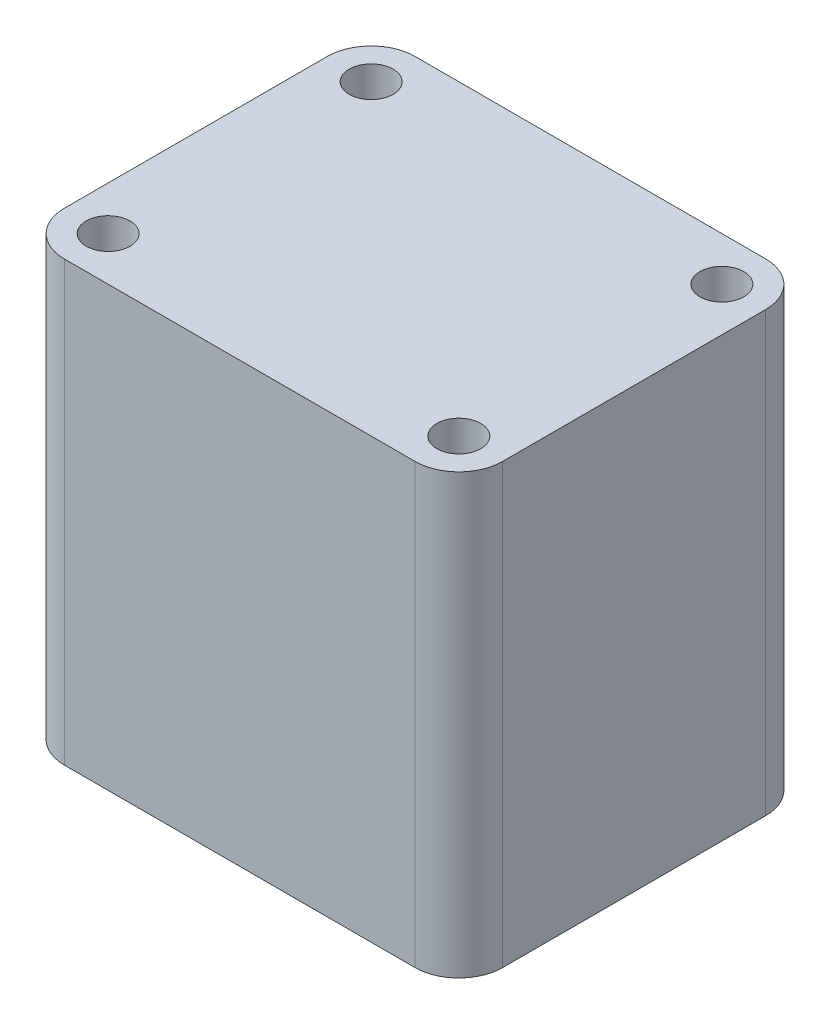
ISO-10303-21;
HEADER;
FILE_DESCRIPTION(('STEP AP214'),'2;1');
FILE_NAME('part.step','',(''),(''),'','','');
FILE_SCHEMA(('AUTOMOTIVE_DESIGN { 1 0 10303 214 1 1 1 1 }'));
ENDSEC;
DATA;
#1=APPLICATION_CONTEXT('core data for automotive mechanical design processes');
#2=APPLICATION_PROTOCOL_DEFINITION('international standard','automotive_design',2000,#1);
#3=PRODUCT_CONTEXT('',#1,'mechanical');
#4=PRODUCT('Part','Part','',(#3));
#5=PRODUCT_RELATED_PRODUCT_CATEGORY('part','',(#4));
#6=PRODUCT_DEFINITION_FORMATION('','',#4);
#7=PRODUCT_DEFINITION_CONTEXT('part definition',#1,'design');
#8=PRODUCT_DEFINITION('design','',#6,#7);
#9=PRODUCT_DEFINITION_SHAPE('','',#8);
#10=(LENGTH_UNIT() NAMED_UNIT(*) SI_UNIT(.MILLI.,.METRE.));
#11=(NAMED_UNIT(*) PLANE_ANGLE_UNIT() SI_UNIT($,.RADIAN.));
#12=(NAMED_UNIT(*) SI_UNIT($,.STERADIAN.) SOLID_ANGLE_UNIT());
#13=UNCERTAINTY_MEASURE_WITH_UNIT(LENGTH_MEASURE(1.E-05),#10,'distance_accuracy_value','');
#14=(GEOMETRIC_REPRESENTATION_CONTEXT(3) GLOBAL_UNCERTAINTY_ASSIGNED_CONTEXT((#13)) GLOBAL_UNIT_ASSIGNED_CONTEXT((#10,
#11,#12)) REPRESENTATION_CONTEXT('',''));
#15=CARTESIAN_POINT('',(0.,0.,0.));
#16=DIRECTION('',(0.,0.,1.));
#17=DIRECTION('',(1.,0.,0.));
#18=AXIS2_PLACEMENT_3D('',#15,#16,#17);
#19=CARTESIAN_POINT('',(-50.,100.,-40.));
#20=DIRECTION('',(1.,0.,0.));
#21=DIRECTION('',(0.,0.,-1.));
#22=AXIS2_PLACEMENT_3D('',#19,#20,#21);
#23=PLANE('',#22);
#24=DIRECTION('',(0.,0.,1.));
#25=VECTOR('',#24,1.);
#26=CARTESIAN_POINT('',(-50.,100.,-40.));
#27=LINE('',#26,#25);
#28=CARTESIAN_POINT('',(-50.,100.,-30.));
#29=VERTEX_POINT('',#28);
#30=CARTESIAN_POINT('',(-50.,100.,30.));
#31=VERTEX_POINT('',#30);
#32=EDGE_CURVE('E131',#29,#31,#27,.T.);
#33=ORIENTED_EDGE('',*,*,#32,.F.);
#34=DIRECTION('',(0.,-1.,0.));
#35=VECTOR('',#34,1.);
#36=CARTESIAN_POINT('',(-50.,100.,-30.));
#37=LINE('',#36,#35);
#38=CARTESIAN_POINT('',(-50.,0.,-30.));
#39=VERTEX_POINT('',#38);
#40=EDGE_CURVE('E115',#29,#39,#37,.T.);
#41=ORIENTED_EDGE('',*,*,#40,.T.);
#42=DIRECTION('',(0.,0.,1.));
#43=VECTOR('',#42,1.);
#44=CARTESIAN_POINT('',(-50.,0.,-40.));
#45=LINE('',#44,#43);
#46=CARTESIAN_POINT('',(-50.,0.,30.));
#47=VERTEX_POINT('',#46);
#48=EDGE_CURVE('E128',#39,#47,#45,.T.);
#49=ORIENTED_EDGE('',*,*,#48,.T.);
#50=DIRECTION('',(0.,-1.,0.));
#51=VECTOR('',#50,1.);
#52=CARTESIAN_POINT('',(-50.,100.,30.));
#53=LINE('',#52,#51);
#54=EDGE_CURVE('E134',#47,#31,#53,.F.);
#55=ORIENTED_EDGE('',*,*,#54,.T.);
#56=EDGE_LOOP('',(#33,#41,#49,#55));
#57=FACE_BOUND('',#56,.T.);
#58=ADVANCED_FACE('F44',(#57),#23,.F.);
#59=CARTESIAN_POINT('',(-50.,100.,40.));
#60=DIRECTION('',(0.,0.,-1.));
#61=DIRECTION('',(-1.,0.,0.));
#62=AXIS2_PLACEMENT_3D('',#59,#60,#61);
#63=PLANE('',#62);
#64=DIRECTION('',(1.,0.,0.));
#65=VECTOR('',#64,1.);
#66=CARTESIAN_POINT('',(-50.,0.,40.));
#67=LINE('',#66,#65);
#68=CARTESIAN_POINT('',(-40.,0.,40.));
#69=VERTEX_POINT('',#68);
#70=CARTESIAN_POINT('',(40.,0.,40.));
#71=VERTEX_POINT('',#70);
#72=EDGE_CURVE('E139',#69,#71,#67,.T.);
#73=ORIENTED_EDGE('',*,*,#72,.T.);
#74=DIRECTION('',(0.,-1.,0.));
#75=VECTOR('',#74,1.);
#76=CARTESIAN_POINT('',(40.,100.,40.));
#77=LINE('',#76,#75);
#78=CARTESIAN_POINT('',(40.,100.,40.));
#79=VERTEX_POINT('',#78);
#80=EDGE_CURVE('E11',#71,#79,#77,.F.);
#81=ORIENTED_EDGE('',*,*,#80,.T.);
#82=DIRECTION('',(1.,0.,0.));
#83=VECTOR('',#82,1.);
#84=CARTESIAN_POINT('',(-50.,100.,40.));
#85=LINE('',#84,#83);
#86=CARTESIAN_POINT('',(-40.,100.,40.));
#87=VERTEX_POINT('',#86);
#88=EDGE_CURVE('E196',#87,#79,#85,.T.);
#89=ORIENTED_EDGE('',*,*,#88,.F.);
#90=DIRECTION('',(0.,-1.,0.));
#91=VECTOR('',#90,1.);
#92=CARTESIAN_POINT('',(-40.,100.,40.));
#93=LINE('',#92,#91);
#94=EDGE_CURVE('E53',#87,#69,#93,.T.);
#95=ORIENTED_EDGE('',*,*,#94,.T.);
#96=EDGE_LOOP('',(#73,#81,#89,#95));
#97=FACE_BOUND('',#96,.T.);
#98=ADVANCED_FACE('F194',(#97),#63,.F.);
#99=CARTESIAN_POINT('',(50.,100.,-40.));
#100=DIRECTION('',(-1.,0.,0.));
#101=DIRECTION('',(0.,0.,1.));
#102=AXIS2_PLACEMENT_3D('',#99,#100,#101);
#103=PLANE('',#102);
#104=DIRECTION('',(0.,0.,-1.));
#105=VECTOR('',#104,1.);
#106=CARTESIAN_POINT('',(50.,0.,-40.));
#107=LINE('',#106,#105);
#108=CARTESIAN_POINT('',(50.,0.,30.));
#109=VERTEX_POINT('',#108);
#110=CARTESIAN_POINT('',(50.,0.,-30.));
#111=VERTEX_POINT('',#110);
#112=EDGE_CURVE('E145',#109,#111,#107,.T.);
#113=ORIENTED_EDGE('',*,*,#112,.T.);
#114=DIRECTION('',(0.,-1.,0.));
#115=VECTOR('',#114,1.);
#116=CARTESIAN_POINT('',(50.,100.,-30.));
#117=LINE('',#116,#115);
#118=CARTESIAN_POINT('',(50.,100.,-30.));
#119=VERTEX_POINT('',#118);
#120=EDGE_CURVE('E60',#111,#119,#117,.F.);
#121=ORIENTED_EDGE('',*,*,#120,.T.);
#122=DIRECTION('',(0.,0.,-1.));
#123=VECTOR('',#122,1.);
#124=CARTESIAN_POINT('',(50.,100.,-40.));
#125=LINE('',#124,#123);
#126=CARTESIAN_POINT('',(50.,100.,30.));
#127=VERTEX_POINT('',#126);
#128=EDGE_CURVE('E204',#127,#119,#125,.T.);
#129=ORIENTED_EDGE('',*,*,#128,.F.);
#130=DIRECTION('',(0.,-1.,0.));
#131=VECTOR('',#130,1.);
#132=CARTESIAN_POINT('',(50.,100.,30.));
#133=LINE('',#132,#131);
#134=EDGE_CURVE('E184',#127,#109,#133,.T.);
#135=ORIENTED_EDGE('',*,*,#134,.T.);
#136=EDGE_LOOP('',(#113,#121,#129,#135));
#137=FACE_BOUND('',#136,.T.);
#138=ADVANCED_FACE('F203',(#137),#103,.F.);
#139=CARTESIAN_POINT('',(-50.,100.,-40.));
#140=DIRECTION('',(0.,0.,1.));
#141=DIRECTION('',(1.,0.,0.));
#142=AXIS2_PLACEMENT_3D('',#139,#140,#141);
#143=PLANE('',#142);
#144=DIRECTION('',(-1.,0.,0.));
#145=VECTOR('',#144,1.);
#146=CARTESIAN_POINT('',(-50.,0.,-40.));
#147=LINE('',#146,#145);
#148=CARTESIAN_POINT('',(40.,0.,-40.));
#149=VERTEX_POINT('',#148);
#150=CARTESIAN_POINT('',(-40.,0.,-40.));
#151=VERTEX_POINT('',#150);
#152=EDGE_CURVE('E156',#149,#151,#147,.T.);
#153=ORIENTED_EDGE('',*,*,#152,.T.);
#154=DIRECTION('',(0.,-1.,0.));
#155=VECTOR('',#154,1.);
#156=CARTESIAN_POINT('',(-40.,100.,-40.));
#157=LINE('',#156,#155);
#158=CARTESIAN_POINT('',(-40.,100.,-40.));
#159=VERTEX_POINT('',#158);
#160=EDGE_CURVE('E116',#151,#159,#157,.F.);
#161=ORIENTED_EDGE('',*,*,#160,.T.);
#162=DIRECTION('',(-1.,0.,0.));
#163=VECTOR('',#162,1.);
#164=CARTESIAN_POINT('',(-50.,100.,-40.));
#165=LINE('',#164,#163);
#166=CARTESIAN_POINT('',(40.,100.,-40.));
#167=VERTEX_POINT('',#166);
#168=EDGE_CURVE('E151',#167,#159,#165,.T.);
#169=ORIENTED_EDGE('',*,*,#168,.F.);
#170=DIRECTION('',(0.,-1.,0.));
#171=VECTOR('',#170,1.);
#172=CARTESIAN_POINT('',(40.,100.,-40.));
#173=LINE('',#172,#171);
#174=EDGE_CURVE('E122',#167,#149,#173,.T.);
#175=ORIENTED_EDGE('',*,*,#174,.T.);
#176=EDGE_LOOP('',(#153,#161,#169,#175));
#177=FACE_BOUND('',#176,.T.);
#178=ADVANCED_FACE('F254',(#177),#143,.F.);
#179=CARTESIAN_POINT('',(0.,100.,0.));
#180=DIRECTION('',(0.,1.,0.));
#181=DIRECTION('',(0.,0.,1.));
#182=AXIS2_PLACEMENT_3D('',#179,#180,#181);
#183=PLANE('',#182);
#184=CARTESIAN_POINT('',(40.,100.,30.));
#185=DIRECTION('',(0.,1.,0.));
#186=DIRECTION('',(0.,0.,-1.));
#187=AXIS2_PLACEMENT_3D('',#184,#185,#186);
#188=CIRCLE('',#187,5.);
#189=CARTESIAN_POINT('',(40.,100.,25.));
#190=VERTEX_POINT('',#189);
#191=EDGE_CURVE('E234',#190,#190,#188,.T.);
#192=ORIENTED_EDGE('',*,*,#191,.F.);
#193=EDGE_LOOP('',(#192));
#194=FACE_BOUND('',#193,.T.);
#195=CARTESIAN_POINT('',(-40.,100.,30.));
#196=DIRECTION('',(0.,-1.,0.));
#197=DIRECTION('',(0.,0.,-1.));
#198=AXIS2_PLACEMENT_3D('',#195,#196,#197);
#199=CIRCLE('',#198,5.);
#200=CARTESIAN_POINT('',(-40.,100.,25.));
#201=VERTEX_POINT('',#200);
#202=EDGE_CURVE('E226',#201,#201,#199,.T.);
#203=ORIENTED_EDGE('',*,*,#202,.T.);
#204=EDGE_LOOP('',(#203));
#205=FACE_BOUND('',#204,.T.);
#206=CARTESIAN_POINT('',(40.,100.,-30.));
#207=DIRECTION('',(0.,-1.,0.));
#208=DIRECTION('',(0.,0.,1.));
#209=AXIS2_PLACEMENT_3D('',#206,#207,#208);
#210=CIRCLE('',#209,5.);
#211=CARTESIAN_POINT('',(40.,100.,-25.));
#212=VERTEX_POINT('',#211);
#213=EDGE_CURVE('E218',#212,#212,#210,.T.);
#214=ORIENTED_EDGE('',*,*,#213,.T.);
#215=EDGE_LOOP('',(#214));
#216=FACE_BOUND('',#215,.T.);
#217=CARTESIAN_POINT('',(-40.,100.,-30.));
#218=DIRECTION('',(0.,1.,0.));
#219=DIRECTION('',(0.,0.,1.));
#220=AXIS2_PLACEMENT_3D('',#217,#218,#219);
#221=CIRCLE('',#220,5.);
#222=CARTESIAN_POINT('',(-40.,100.,-25.));
#223=VERTEX_POINT('',#222);
#224=EDGE_CURVE('E148',#223,#223,#221,.T.);
#225=ORIENTED_EDGE('',*,*,#224,.F.);
#226=EDGE_LOOP('',(#225));
#227=FACE_BOUND('',#226,.T.);
#228=ORIENTED_EDGE('',*,*,#168,.T.);
#229=CARTESIAN_POINT('',(-40.,100.,-30.));
#230=DIRECTION('',(0.,1.,0.));
#231=DIRECTION('',(0.,0.,1.));
#232=AXIS2_PLACEMENT_3D('',#229,#230,#231);
#233=CIRCLE('',#232,10.);
#234=EDGE_CURVE('E181',#159,#29,#233,.T.);
#235=ORIENTED_EDGE('',*,*,#234,.T.);
#236=ORIENTED_EDGE('',*,*,#32,.T.);
#237=CARTESIAN_POINT('',(-40.,100.,30.));
#238=DIRECTION('',(0.,1.,0.));
#239=DIRECTION('',(0.,0.,1.));
#240=AXIS2_PLACEMENT_3D('',#237,#238,#239);
#241=CIRCLE('',#240,10.);
#242=EDGE_CURVE('E173',#31,#87,#241,.T.);
#243=ORIENTED_EDGE('',*,*,#242,.T.);
#244=ORIENTED_EDGE('',*,*,#88,.T.);
#245=CARTESIAN_POINT('',(40.,100.,30.));
#246=DIRECTION('',(0.,1.,0.));
#247=DIRECTION('',(0.,0.,1.));
#248=AXIS2_PLACEMENT_3D('',#245,#246,#247);
#249=CIRCLE('',#248,10.);
#250=EDGE_CURVE('E67',#79,#127,#249,.T.);
#251=ORIENTED_EDGE('',*,*,#250,.T.);
#252=ORIENTED_EDGE('',*,*,#128,.T.);
#253=CARTESIAN_POINT('',(40.,100.,-30.));
#254=DIRECTION('',(0.,1.,0.));
#255=DIRECTION('',(0.,0.,1.));
#256=AXIS2_PLACEMENT_3D('',#253,#254,#255);
#257=CIRCLE('',#256,10.);
#258=EDGE_CURVE('E178',#119,#167,#257,.T.);
#259=ORIENTED_EDGE('',*,*,#258,.T.);
#260=EDGE_LOOP('',(#228,#235,#236,#243,#244,#251,#252,#259));
#261=FACE_BOUND('',#260,.T.);
#262=ADVANCED_FACE('F251',(#194,#205,#216,#227,#261),#183,.T.);
#263=CARTESIAN_POINT('',(0.,0.,0.));
#264=DIRECTION('',(0.,1.,0.));
#265=DIRECTION('',(0.,0.,1.));
#266=AXIS2_PLACEMENT_3D('',#263,#264,#265);
#267=PLANE('',#266);
#268=CARTESIAN_POINT('',(40.,0.,30.));
#269=DIRECTION('',(0.,1.,0.));
#270=DIRECTION('',(0.,0.,-1.));
#271=AXIS2_PLACEMENT_3D('',#268,#269,#270);
#272=CIRCLE('',#271,5.);
#273=CARTESIAN_POINT('',(40.,0.,25.));
#274=VERTEX_POINT('',#273);
#275=EDGE_CURVE('E230',#274,#274,#272,.T.);
#276=ORIENTED_EDGE('',*,*,#275,.T.);
#277=EDGE_LOOP('',(#276));
#278=FACE_BOUND('',#277,.T.);
#279=CARTESIAN_POINT('',(-40.,0.,30.));
#280=DIRECTION('',(0.,-1.,0.));
#281=DIRECTION('',(0.,0.,-1.));
#282=AXIS2_PLACEMENT_3D('',#279,#280,#281);
#283=CIRCLE('',#282,5.);
#284=CARTESIAN_POINT('',(-40.,0.,25.));
#285=VERTEX_POINT('',#284);
#286=EDGE_CURVE('E222',#285,#285,#283,.T.);
#287=ORIENTED_EDGE('',*,*,#286,.F.);
#288=EDGE_LOOP('',(#287));
#289=FACE_BOUND('',#288,.T.);
#290=CARTESIAN_POINT('',(40.,0.,-30.));
#291=DIRECTION('',(0.,-1.,0.));
#292=DIRECTION('',(0.,0.,1.));
#293=AXIS2_PLACEMENT_3D('',#290,#291,#292);
#294=CIRCLE('',#293,5.);
#295=CARTESIAN_POINT('',(40.,0.,-25.));
#296=VERTEX_POINT('',#295);
#297=EDGE_CURVE('E216',#296,#296,#294,.T.);
#298=ORIENTED_EDGE('',*,*,#297,.F.);
#299=EDGE_LOOP('',(#298));
#300=FACE_BOUND('',#299,.T.);
#301=CARTESIAN_POINT('',(-40.,0.,-30.));
#302=DIRECTION('',(0.,1.,0.));
#303=DIRECTION('',(0.,0.,1.));
#304=AXIS2_PLACEMENT_3D('',#301,#302,#303);
#305=CIRCLE('',#304,5.);
#306=CARTESIAN_POINT('',(-40.,0.,-25.));
#307=VERTEX_POINT('',#306);
#308=EDGE_CURVE('E140',#307,#307,#305,.T.);
#309=ORIENTED_EDGE('',*,*,#308,.T.);
#310=EDGE_LOOP('',(#309));
#311=FACE_BOUND('',#310,.T.);
#312=ORIENTED_EDGE('',*,*,#48,.F.);
#313=CARTESIAN_POINT('',(-40.,0.,-30.));
#314=DIRECTION('',(0.,1.,0.));
#315=DIRECTION('',(0.,0.,1.));
#316=AXIS2_PLACEMENT_3D('',#313,#314,#315);
#317=CIRCLE('',#316,10.);
#318=EDGE_CURVE('E111',#39,#151,#317,.F.);
#319=ORIENTED_EDGE('',*,*,#318,.T.);
#320=ORIENTED_EDGE('',*,*,#152,.F.);
#321=CARTESIAN_POINT('',(40.,0.,-30.));
#322=DIRECTION('',(0.,1.,0.));
#323=DIRECTION('',(0.,0.,1.));
#324=AXIS2_PLACEMENT_3D('',#321,#322,#323);
#325=CIRCLE('',#324,10.);
#326=EDGE_CURVE('E123',#149,#111,#325,.F.);
#327=ORIENTED_EDGE('',*,*,#326,.T.);
#328=ORIENTED_EDGE('',*,*,#112,.F.);
#329=CARTESIAN_POINT('',(40.,0.,30.));
#330=DIRECTION('',(0.,1.,0.));
#331=DIRECTION('',(0.,0.,1.));
#332=AXIS2_PLACEMENT_3D('',#329,#330,#331);
#333=CIRCLE('',#332,10.);
#334=EDGE_CURVE('E163',#109,#71,#333,.F.);
#335=ORIENTED_EDGE('',*,*,#334,.T.);
#336=ORIENTED_EDGE('',*,*,#72,.F.);
#337=CARTESIAN_POINT('',(-40.,0.,30.));
#338=DIRECTION('',(0.,1.,0.));
#339=DIRECTION('',(0.,0.,1.));
#340=AXIS2_PLACEMENT_3D('',#337,#338,#339);
#341=CIRCLE('',#340,10.);
#342=EDGE_CURVE('E133',#69,#47,#341,.F.);
#343=ORIENTED_EDGE('',*,*,#342,.T.);
#344=EDGE_LOOP('',(#312,#319,#320,#327,#328,#335,#336,#343));
#345=FACE_BOUND('',#344,.T.);
#346=ADVANCED_FACE('F136',(#278,#289,#300,#311,#345),#267,.F.);
#347=CARTESIAN_POINT('',(-40.,100.,-30.));
#348=DIRECTION('',(0.,-1.,0.));
#349=DIRECTION('',(0.,0.,-1.));
#350=AXIS2_PLACEMENT_3D('',#347,#348,#349);
#351=CYLINDRICAL_SURFACE('',#350,10.);
#352=ORIENTED_EDGE('',*,*,#234,.F.);
#353=ORIENTED_EDGE('',*,*,#160,.F.);
#354=ORIENTED_EDGE('',*,*,#318,.F.);
#355=ORIENTED_EDGE('',*,*,#40,.F.);
#356=EDGE_LOOP('',(#352,#353,#354,#355));
#357=FACE_BOUND('',#356,.T.);
#358=ADVANCED_FACE('F114',(#357),#351,.T.);
#359=CARTESIAN_POINT('',(40.,100.,-30.));
#360=DIRECTION('',(0.,-1.,0.));
#361=DIRECTION('',(0.,0.,-1.));
#362=AXIS2_PLACEMENT_3D('',#359,#360,#361);
#363=CYLINDRICAL_SURFACE('',#362,10.);
#364=ORIENTED_EDGE('',*,*,#258,.F.);
#365=ORIENTED_EDGE('',*,*,#120,.F.);
#366=ORIENTED_EDGE('',*,*,#326,.F.);
#367=ORIENTED_EDGE('',*,*,#174,.F.);
#368=EDGE_LOOP('',(#364,#365,#366,#367));
#369=FACE_BOUND('',#368,.T.);
#370=ADVANCED_FACE('F265',(#369),#363,.T.);
#371=CARTESIAN_POINT('',(40.,100.,30.));
#372=DIRECTION('',(0.,-1.,0.));
#373=DIRECTION('',(0.,0.,-1.));
#374=AXIS2_PLACEMENT_3D('',#371,#372,#373);
#375=CYLINDRICAL_SURFACE('',#374,10.);
#376=ORIENTED_EDGE('',*,*,#250,.F.);
#377=ORIENTED_EDGE('',*,*,#80,.F.);
#378=ORIENTED_EDGE('',*,*,#334,.F.);
#379=ORIENTED_EDGE('',*,*,#134,.F.);
#380=EDGE_LOOP('',(#376,#377,#378,#379));
#381=FACE_BOUND('',#380,.T.);
#382=ADVANCED_FACE('F202',(#381),#375,.T.);
#383=CARTESIAN_POINT('',(-40.,100.,30.));
#384=DIRECTION('',(0.,-1.,0.));
#385=DIRECTION('',(0.,0.,-1.));
#386=AXIS2_PLACEMENT_3D('',#383,#384,#385);
#387=CYLINDRICAL_SURFACE('',#386,10.);
#388=ORIENTED_EDGE('',*,*,#242,.F.);
#389=ORIENTED_EDGE('',*,*,#54,.F.);
#390=ORIENTED_EDGE('',*,*,#342,.F.);
#391=ORIENTED_EDGE('',*,*,#94,.F.);
#392=EDGE_LOOP('',(#388,#389,#390,#391));
#393=FACE_BOUND('',#392,.T.);
#394=ADVANCED_FACE('F46',(#393),#387,.T.);
#395=CARTESIAN_POINT('',(-40.,0.,-30.));
#396=DIRECTION('',(0.,1.,0.));
#397=DIRECTION('',(0.,0.,1.));
#398=AXIS2_PLACEMENT_3D('',#395,#396,#397);
#399=CYLINDRICAL_SURFACE('',#398,5.);
#400=ORIENTED_EDGE('',*,*,#308,.F.);
#401=EDGE_LOOP('',(#400));
#402=FACE_BOUND('',#401,.T.);
#403=ORIENTED_EDGE('',*,*,#224,.T.);
#404=EDGE_LOOP('',(#403));
#405=FACE_BOUND('',#404,.T.);
#406=ADVANCED_FACE('F286',(#402,#405),#399,.F.);
#407=CARTESIAN_POINT('',(40.,0.,-30.));
#408=DIRECTION('',(0.,1.,0.));
#409=DIRECTION('',(0.,0.,1.));
#410=AXIS2_PLACEMENT_3D('',#407,#408,#409);
#411=CYLINDRICAL_SURFACE('',#410,5.);
#412=ORIENTED_EDGE('',*,*,#297,.T.);
#413=EDGE_LOOP('',(#412));
#414=FACE_BOUND('',#413,.T.);
#415=ORIENTED_EDGE('',*,*,#213,.F.);
#416=EDGE_LOOP('',(#415));
#417=FACE_BOUND('',#416,.T.);
#418=ADVANCED_FACE('F289',(#414,#417),#411,.F.);
#419=CARTESIAN_POINT('',(-40.,0.,30.));
#420=DIRECTION('',(0.,1.,0.));
#421=DIRECTION('',(0.,0.,1.));
#422=AXIS2_PLACEMENT_3D('',#419,#420,#421);
#423=CYLINDRICAL_SURFACE('',#422,5.);
#424=ORIENTED_EDGE('',*,*,#286,.T.);
#425=EDGE_LOOP('',(#424));
#426=FACE_BOUND('',#425,.T.);
#427=ORIENTED_EDGE('',*,*,#202,.F.);
#428=EDGE_LOOP('',(#427));
#429=FACE_BOUND('',#428,.T.);
#430=ADVANCED_FACE('F247',(#426,#429),#423,.F.);
#431=CARTESIAN_POINT('',(40.,0.,30.));
#432=DIRECTION('',(0.,1.,0.));
#433=DIRECTION('',(0.,0.,1.));
#434=AXIS2_PLACEMENT_3D('',#431,#432,#433);
#435=CYLINDRICAL_SURFACE('',#434,5.);
#436=ORIENTED_EDGE('',*,*,#275,.F.);
#437=EDGE_LOOP('',(#436));
#438=FACE_BOUND('',#437,.T.);
#439=ORIENTED_EDGE('',*,*,#191,.T.);
#440=EDGE_LOOP('',(#439));
#441=FACE_BOUND('',#440,.T.);
#442=ADVANCED_FACE('F244',(#438,#441),#435,.F.);
#443=CLOSED_SHELL('',(#58,#98,#138,#178,#262,#346,#358,#370,#382,#394,#406,#418,#430,#442));
#444=MANIFOLD_SOLID_BREP('B2',#443);
#445=ADVANCED_BREP_SHAPE_REPRESENTATION('',(#18,#444),#14);
#446=SHAPE_DEFINITION_REPRESENTATION(#9,#445);
ENDSEC;
END-ISO-10303-21;
